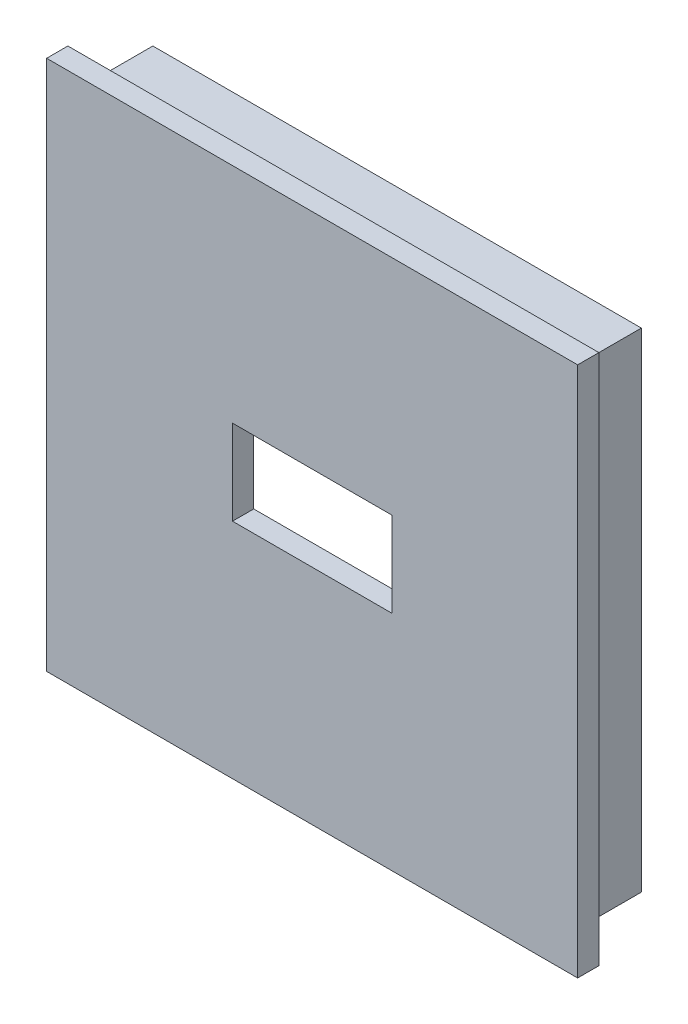
ISO-10303-21;
HEADER;
FILE_DESCRIPTION(('STEP AP214'),'2;1');
FILE_NAME('part.step','',(''),(''),'','','');
FILE_SCHEMA(('AUTOMOTIVE_DESIGN { 1 0 10303 214 1 1 1 1 }'));
ENDSEC;
DATA;
#1=APPLICATION_CONTEXT('core data for automotive mechanical design processes');
#2=APPLICATION_PROTOCOL_DEFINITION('international standard','automotive_design',2000,#1);
#3=PRODUCT_CONTEXT('',#1,'mechanical');
#4=PRODUCT('Part','Part','',(#3));
#5=PRODUCT_RELATED_PRODUCT_CATEGORY('part','',(#4));
#6=PRODUCT_DEFINITION_FORMATION('','',#4);
#7=PRODUCT_DEFINITION_CONTEXT('part definition',#1,'design');
#8=PRODUCT_DEFINITION('design','',#6,#7);
#9=PRODUCT_DEFINITION_SHAPE('','',#8);
#10=(LENGTH_UNIT() NAMED_UNIT(*) SI_UNIT(.MILLI.,.METRE.));
#11=(NAMED_UNIT(*) PLANE_ANGLE_UNIT() SI_UNIT($,.RADIAN.));
#12=(NAMED_UNIT(*) SI_UNIT($,.STERADIAN.) SOLID_ANGLE_UNIT());
#13=UNCERTAINTY_MEASURE_WITH_UNIT(LENGTH_MEASURE(1.E-05),#10,'distance_accuracy_value','');
#14=(GEOMETRIC_REPRESENTATION_CONTEXT(3) GLOBAL_UNCERTAINTY_ASSIGNED_CONTEXT((#13)) GLOBAL_UNIT_ASSIGNED_CONTEXT((#10,
#11,#12)) REPRESENTATION_CONTEXT('',''));
#15=CARTESIAN_POINT('',(0.,0.,0.));
#16=DIRECTION('',(0.,0.,1.));
#17=DIRECTION('',(1.,0.,0.));
#18=AXIS2_PLACEMENT_3D('',#15,#16,#17);
#19=CARTESIAN_POINT('',(0.,0.,-3.));
#20=DIRECTION('',(0.,0.,1.));
#21=DIRECTION('',(1.,0.,0.));
#22=AXIS2_PLACEMENT_3D('',#19,#20,#21);
#23=PLANE('',#22);
#24=DIRECTION('',(0.,1.,0.));
#25=VECTOR('',#24,1.);
#26=CARTESIAN_POINT('',(-11.5,-11.5,-3.));
#27=LINE('',#26,#25);
#28=CARTESIAN_POINT('',(-11.5,-11.5,-3.));
#29=VERTEX_POINT('',#28);
#30=CARTESIAN_POINT('',(-11.5,11.5,-3.));
#31=VERTEX_POINT('',#30);
#32=EDGE_CURVE('E231',#29,#31,#27,.T.);
#33=ORIENTED_EDGE('',*,*,#32,.T.);
#34=DIRECTION('',(1.,0.,0.));
#35=VECTOR('',#34,1.);
#36=CARTESIAN_POINT('',(11.5,11.5,-3.));
#37=LINE('',#36,#35);
#38=CARTESIAN_POINT('',(11.5,11.5,-3.));
#39=VERTEX_POINT('',#38);
#40=EDGE_CURVE('E235',#31,#39,#37,.T.);
#41=ORIENTED_EDGE('',*,*,#40,.T.);
#42=DIRECTION('',(0.,-1.,0.));
#43=VECTOR('',#42,1.);
#44=CARTESIAN_POINT('',(11.5,-11.5,-3.));
#45=LINE('',#44,#43);
#46=CARTESIAN_POINT('',(11.5,-11.5,-3.));
#47=VERTEX_POINT('',#46);
#48=EDGE_CURVE('E239',#39,#47,#45,.T.);
#49=ORIENTED_EDGE('',*,*,#48,.T.);
#50=DIRECTION('',(-1.,0.,0.));
#51=VECTOR('',#50,1.);
#52=CARTESIAN_POINT('',(11.5,-11.5,-3.));
#53=LINE('',#52,#51);
#54=EDGE_CURVE('E242',#47,#29,#53,.T.);
#55=ORIENTED_EDGE('',*,*,#54,.T.);
#56=EDGE_LOOP('',(#33,#41,#49,#55));
#57=FACE_BOUND('',#56,.T.);
#58=DIRECTION('',(0.,1.,0.));
#59=VECTOR('',#58,1.);
#60=CARTESIAN_POINT('',(-10.5,0.,-3.));
#61=LINE('',#60,#59);
#62=CARTESIAN_POINT('',(-10.5,-10.5,-3.));
#63=VERTEX_POINT('',#62);
#64=CARTESIAN_POINT('',(-10.5,10.5,-3.));
#65=VERTEX_POINT('',#64);
#66=EDGE_CURVE('E183',#63,#65,#61,.T.);
#67=ORIENTED_EDGE('',*,*,#66,.F.);
#68=DIRECTION('',(-1.,0.,0.));
#69=VECTOR('',#68,1.);
#70=CARTESIAN_POINT('',(0.,-10.5,-3.));
#71=LINE('',#70,#69);
#72=CARTESIAN_POINT('',(10.5,-10.5,-3.));
#73=VERTEX_POINT('',#72);
#74=EDGE_CURVE('E200',#73,#63,#71,.T.);
#75=ORIENTED_EDGE('',*,*,#74,.F.);
#76=DIRECTION('',(0.,-1.,0.));
#77=VECTOR('',#76,1.);
#78=CARTESIAN_POINT('',(10.5,0.,-3.));
#79=LINE('',#78,#77);
#80=CARTESIAN_POINT('',(10.5,10.5,-3.));
#81=VERTEX_POINT('',#80);
#82=EDGE_CURVE('E212',#81,#73,#79,.T.);
#83=ORIENTED_EDGE('',*,*,#82,.F.);
#84=DIRECTION('',(1.,0.,0.));
#85=VECTOR('',#84,1.);
#86=CARTESIAN_POINT('',(0.,10.5,-3.));
#87=LINE('',#86,#85);
#88=EDGE_CURVE('E209',#65,#81,#87,.T.);
#89=ORIENTED_EDGE('',*,*,#88,.F.);
#90=EDGE_LOOP('',(#67,#75,#83,#89));
#91=FACE_BOUND('',#90,.T.);
#92=ADVANCED_FACE('F38',(#57,#91),#23,.F.);
#93=CARTESIAN_POINT('',(12.5,-12.5,1.));
#94=DIRECTION('',(-1.,0.,0.));
#95=DIRECTION('',(0.,0.,1.));
#96=AXIS2_PLACEMENT_3D('',#93,#94,#95);
#97=PLANE('',#96);
#98=DIRECTION('',(0.,1.,0.));
#99=VECTOR('',#98,1.);
#100=CARTESIAN_POINT('',(12.5,-12.5,0.));
#101=LINE('',#100,#99);
#102=CARTESIAN_POINT('',(12.5,-12.5,0.));
#103=VERTEX_POINT('',#102);
#104=CARTESIAN_POINT('',(12.5,12.5,0.));
#105=VERTEX_POINT('',#104);
#106=EDGE_CURVE('E275',#103,#105,#101,.T.);
#107=ORIENTED_EDGE('',*,*,#106,.T.);
#108=DIRECTION('',(0.,0.,-1.));
#109=VECTOR('',#108,1.);
#110=CARTESIAN_POINT('',(12.5,12.5,1.));
#111=LINE('',#110,#109);
#112=CARTESIAN_POINT('',(12.5,12.5,1.));
#113=VERTEX_POINT('',#112);
#114=EDGE_CURVE('E313',#113,#105,#111,.T.);
#115=ORIENTED_EDGE('',*,*,#114,.F.);
#116=DIRECTION('',(0.,1.,0.));
#117=VECTOR('',#116,1.);
#118=CARTESIAN_POINT('',(12.5,-12.5,1.));
#119=LINE('',#118,#117);
#120=CARTESIAN_POINT('',(12.5,-12.5,1.));
#121=VERTEX_POINT('',#120);
#122=EDGE_CURVE('E276',#121,#113,#119,.T.);
#123=ORIENTED_EDGE('',*,*,#122,.F.);
#124=DIRECTION('',(0.,0.,-1.));
#125=VECTOR('',#124,1.);
#126=CARTESIAN_POINT('',(12.5,-12.5,1.));
#127=LINE('',#126,#125);
#128=EDGE_CURVE('E290',#121,#103,#127,.T.);
#129=ORIENTED_EDGE('',*,*,#128,.T.);
#130=EDGE_LOOP('',(#107,#115,#123,#129));
#131=FACE_BOUND('',#130,.T.);
#132=ADVANCED_FACE('F40',(#131),#97,.F.);
#133=CARTESIAN_POINT('',(-12.5,12.5,1.));
#134=DIRECTION('',(0.,-1.,0.));
#135=DIRECTION('',(0.,0.,-1.));
#136=AXIS2_PLACEMENT_3D('',#133,#134,#135);
#137=PLANE('',#136);
#138=DIRECTION('',(-1.,0.,0.));
#139=VECTOR('',#138,1.);
#140=CARTESIAN_POINT('',(-12.5,12.5,0.));
#141=LINE('',#140,#139);
#142=CARTESIAN_POINT('',(-12.5,12.5,0.));
#143=VERTEX_POINT('',#142);
#144=EDGE_CURVE('E294',#105,#143,#141,.T.);
#145=ORIENTED_EDGE('',*,*,#144,.T.);
#146=DIRECTION('',(0.,0.,-1.));
#147=VECTOR('',#146,1.);
#148=CARTESIAN_POINT('',(-12.5,12.5,1.));
#149=LINE('',#148,#147);
#150=CARTESIAN_POINT('',(-12.5,12.5,1.));
#151=VERTEX_POINT('',#150);
#152=EDGE_CURVE('E309',#151,#143,#149,.T.);
#153=ORIENTED_EDGE('',*,*,#152,.F.);
#154=DIRECTION('',(-1.,0.,0.));
#155=VECTOR('',#154,1.);
#156=CARTESIAN_POINT('',(-12.5,12.5,1.));
#157=LINE('',#156,#155);
#158=EDGE_CURVE('E280',#113,#151,#157,.T.);
#159=ORIENTED_EDGE('',*,*,#158,.F.);
#160=ORIENTED_EDGE('',*,*,#114,.T.);
#161=EDGE_LOOP('',(#145,#153,#159,#160));
#162=FACE_BOUND('',#161,.T.);
#163=ADVANCED_FACE('F344',(#162),#137,.F.);
#164=CARTESIAN_POINT('',(-12.5,-12.5,1.));
#165=DIRECTION('',(1.,0.,0.));
#166=DIRECTION('',(0.,0.,-1.));
#167=AXIS2_PLACEMENT_3D('',#164,#165,#166);
#168=PLANE('',#167);
#169=DIRECTION('',(0.,-1.,0.));
#170=VECTOR('',#169,1.);
#171=CARTESIAN_POINT('',(-12.5,-12.5,0.));
#172=LINE('',#171,#170);
#173=CARTESIAN_POINT('',(-12.5,-12.5,0.));
#174=VERTEX_POINT('',#173);
#175=EDGE_CURVE('E297',#143,#174,#172,.T.);
#176=ORIENTED_EDGE('',*,*,#175,.T.);
#177=DIRECTION('',(0.,0.,-1.));
#178=VECTOR('',#177,1.);
#179=CARTESIAN_POINT('',(-12.5,-12.5,1.));
#180=LINE('',#179,#178);
#181=CARTESIAN_POINT('',(-12.5,-12.5,1.));
#182=VERTEX_POINT('',#181);
#183=EDGE_CURVE('E305',#182,#174,#180,.T.);
#184=ORIENTED_EDGE('',*,*,#183,.F.);
#185=DIRECTION('',(0.,-1.,0.));
#186=VECTOR('',#185,1.);
#187=CARTESIAN_POINT('',(-12.5,-12.5,1.));
#188=LINE('',#187,#186);
#189=EDGE_CURVE('E284',#151,#182,#188,.T.);
#190=ORIENTED_EDGE('',*,*,#189,.F.);
#191=ORIENTED_EDGE('',*,*,#152,.T.);
#192=EDGE_LOOP('',(#176,#184,#190,#191));
#193=FACE_BOUND('',#192,.T.);
#194=ADVANCED_FACE('F376',(#193),#168,.F.);
#195=CARTESIAN_POINT('',(-12.5,-12.5,1.));
#196=DIRECTION('',(0.,1.,0.));
#197=DIRECTION('',(0.,0.,1.));
#198=AXIS2_PLACEMENT_3D('',#195,#196,#197);
#199=PLANE('',#198);
#200=DIRECTION('',(1.,0.,0.));
#201=VECTOR('',#200,1.);
#202=CARTESIAN_POINT('',(-12.5,-12.5,0.));
#203=LINE('',#202,#201);
#204=EDGE_CURVE('E281',#174,#103,#203,.T.);
#205=ORIENTED_EDGE('',*,*,#204,.T.);
#206=ORIENTED_EDGE('',*,*,#128,.F.);
#207=DIRECTION('',(1.,0.,0.));
#208=VECTOR('',#207,1.);
#209=CARTESIAN_POINT('',(-12.5,-12.5,1.));
#210=LINE('',#209,#208);
#211=EDGE_CURVE('E287',#182,#121,#210,.T.);
#212=ORIENTED_EDGE('',*,*,#211,.F.);
#213=ORIENTED_EDGE('',*,*,#183,.T.);
#214=EDGE_LOOP('',(#205,#206,#212,#213));
#215=FACE_BOUND('',#214,.T.);
#216=ADVANCED_FACE('F370',(#215),#199,.F.);
#217=CARTESIAN_POINT('',(0.,0.,1.));
#218=DIRECTION('',(0.,0.,-1.));
#219=DIRECTION('',(-1.,0.,0.));
#220=AXIS2_PLACEMENT_3D('',#217,#218,#219);
#221=PLANE('',#220);
#222=DIRECTION('',(-1.,0.,0.));
#223=VECTOR('',#222,1.);
#224=CARTESIAN_POINT('',(0.,-2.,1.));
#225=LINE('',#224,#223);
#226=CARTESIAN_POINT('',(3.75,-2.,0.999999999999999));
#227=VERTEX_POINT('',#226);
#228=CARTESIAN_POINT('',(-3.75,-2.,0.999999999999999));
#229=VERTEX_POINT('',#228);
#230=EDGE_CURVE('E47',#227,#229,#225,.T.);
#231=ORIENTED_EDGE('',*,*,#230,.T.);
#232=DIRECTION('',(0.,1.,0.));
#233=VECTOR('',#232,1.);
#234=CARTESIAN_POINT('',(-3.75,0.,1.));
#235=LINE('',#234,#233);
#236=CARTESIAN_POINT('',(-3.75,2.,0.999999999999999));
#237=VERTEX_POINT('',#236);
#238=EDGE_CURVE('E11',#229,#237,#235,.T.);
#239=ORIENTED_EDGE('',*,*,#238,.T.);
#240=DIRECTION('',(1.,0.,0.));
#241=VECTOR('',#240,1.);
#242=CARTESIAN_POINT('',(0.,2.,1.));
#243=LINE('',#242,#241);
#244=CARTESIAN_POINT('',(3.75,2.,1.));
#245=VERTEX_POINT('',#244);
#246=EDGE_CURVE('E157',#237,#245,#243,.T.);
#247=ORIENTED_EDGE('',*,*,#246,.T.);
#248=DIRECTION('',(0.,-1.,0.));
#249=VECTOR('',#248,1.);
#250=CARTESIAN_POINT('',(3.75,0.,1.));
#251=LINE('',#250,#249);
#252=EDGE_CURVE('E319',#245,#227,#251,.T.);
#253=ORIENTED_EDGE('',*,*,#252,.T.);
#254=EDGE_LOOP('',(#231,#239,#247,#253));
#255=FACE_BOUND('',#254,.T.);
#256=ORIENTED_EDGE('',*,*,#122,.T.);
#257=ORIENTED_EDGE('',*,*,#158,.T.);
#258=ORIENTED_EDGE('',*,*,#189,.T.);
#259=ORIENTED_EDGE('',*,*,#211,.T.);
#260=EDGE_LOOP('',(#256,#257,#258,#259));
#261=FACE_BOUND('',#260,.T.);
#262=ADVANCED_FACE('F325',(#255,#261),#221,.F.);
#263=CARTESIAN_POINT('',(0.,0.,0.));
#264=DIRECTION('',(0.,0.,-1.));
#265=DIRECTION('',(-1.,0.,0.));
#266=AXIS2_PLACEMENT_3D('',#263,#264,#265);
#267=PLANE('',#266);
#268=DIRECTION('',(0.,1.,0.));
#269=VECTOR('',#268,1.);
#270=CARTESIAN_POINT('',(-11.5,-11.5,0.));
#271=LINE('',#270,#269);
#272=CARTESIAN_POINT('',(-11.5,-11.5,0.));
#273=VERTEX_POINT('',#272);
#274=CARTESIAN_POINT('',(-11.5,11.5,0.));
#275=VERTEX_POINT('',#274);
#276=EDGE_CURVE('E230',#273,#275,#271,.T.);
#277=ORIENTED_EDGE('',*,*,#276,.F.);
#278=DIRECTION('',(-1.,0.,0.));
#279=VECTOR('',#278,1.);
#280=CARTESIAN_POINT('',(11.5,-11.5,0.));
#281=LINE('',#280,#279);
#282=CARTESIAN_POINT('',(11.5,-11.5,0.));
#283=VERTEX_POINT('',#282);
#284=EDGE_CURVE('E236',#283,#273,#281,.T.);
#285=ORIENTED_EDGE('',*,*,#284,.F.);
#286=DIRECTION('',(0.,-1.,0.));
#287=VECTOR('',#286,1.);
#288=CARTESIAN_POINT('',(11.5,-11.5,0.));
#289=LINE('',#288,#287);
#290=CARTESIAN_POINT('',(11.5,11.5,0.));
#291=VERTEX_POINT('',#290);
#292=EDGE_CURVE('E253',#291,#283,#289,.T.);
#293=ORIENTED_EDGE('',*,*,#292,.F.);
#294=DIRECTION('',(1.,0.,0.));
#295=VECTOR('',#294,1.);
#296=CARTESIAN_POINT('',(11.5,11.5,0.));
#297=LINE('',#296,#295);
#298=EDGE_CURVE('E249',#275,#291,#297,.T.);
#299=ORIENTED_EDGE('',*,*,#298,.F.);
#300=EDGE_LOOP('',(#277,#285,#293,#299));
#301=FACE_BOUND('',#300,.T.);
#302=ORIENTED_EDGE('',*,*,#106,.F.);
#303=ORIENTED_EDGE('',*,*,#204,.F.);
#304=ORIENTED_EDGE('',*,*,#175,.F.);
#305=ORIENTED_EDGE('',*,*,#144,.F.);
#306=EDGE_LOOP('',(#302,#303,#304,#305));
#307=FACE_BOUND('',#306,.T.);
#308=ADVANCED_FACE('F366',(#301,#307),#267,.T.);
#309=CARTESIAN_POINT('',(-11.5,-11.5,-3.));
#310=DIRECTION('',(1.,0.,0.));
#311=DIRECTION('',(0.,0.,-1.));
#312=AXIS2_PLACEMENT_3D('',#309,#310,#311);
#313=PLANE('',#312);
#314=ORIENTED_EDGE('',*,*,#276,.T.);
#315=DIRECTION('',(0.,0.,1.));
#316=VECTOR('',#315,1.);
#317=CARTESIAN_POINT('',(-11.5,11.5,-3.));
#318=LINE('',#317,#316);
#319=EDGE_CURVE('E271',#31,#275,#318,.T.);
#320=ORIENTED_EDGE('',*,*,#319,.F.);
#321=ORIENTED_EDGE('',*,*,#32,.F.);
#322=DIRECTION('',(0.,0.,1.));
#323=VECTOR('',#322,1.);
#324=CARTESIAN_POINT('',(-11.5,-11.5,-3.));
#325=LINE('',#324,#323);
#326=EDGE_CURVE('E245',#29,#273,#325,.T.);
#327=ORIENTED_EDGE('',*,*,#326,.T.);
#328=EDGE_LOOP('',(#314,#320,#321,#327));
#329=FACE_BOUND('',#328,.T.);
#330=ADVANCED_FACE('F362',(#329),#313,.F.);
#331=CARTESIAN_POINT('',(11.5,11.5,-3.));
#332=DIRECTION('',(0.,-1.,0.));
#333=DIRECTION('',(0.,0.,-1.));
#334=AXIS2_PLACEMENT_3D('',#331,#332,#333);
#335=PLANE('',#334);
#336=ORIENTED_EDGE('',*,*,#298,.T.);
#337=DIRECTION('',(0.,0.,1.));
#338=VECTOR('',#337,1.);
#339=CARTESIAN_POINT('',(11.5,11.5,-3.));
#340=LINE('',#339,#338);
#341=EDGE_CURVE('E267',#39,#291,#340,.T.);
#342=ORIENTED_EDGE('',*,*,#341,.F.);
#343=ORIENTED_EDGE('',*,*,#40,.F.);
#344=ORIENTED_EDGE('',*,*,#319,.T.);
#345=EDGE_LOOP('',(#336,#342,#343,#344));
#346=FACE_BOUND('',#345,.T.);
#347=ADVANCED_FACE('F358',(#346),#335,.F.);
#348=CARTESIAN_POINT('',(11.5,-11.5,-3.));
#349=DIRECTION('',(-1.,0.,0.));
#350=DIRECTION('',(0.,0.,1.));
#351=AXIS2_PLACEMENT_3D('',#348,#349,#350);
#352=PLANE('',#351);
#353=ORIENTED_EDGE('',*,*,#292,.T.);
#354=DIRECTION('',(0.,0.,1.));
#355=VECTOR('',#354,1.);
#356=CARTESIAN_POINT('',(11.5,-11.5,-3.));
#357=LINE('',#356,#355);
#358=EDGE_CURVE('E263',#47,#283,#357,.T.);
#359=ORIENTED_EDGE('',*,*,#358,.F.);
#360=ORIENTED_EDGE('',*,*,#48,.F.);
#361=ORIENTED_EDGE('',*,*,#341,.T.);
#362=EDGE_LOOP('',(#353,#359,#360,#361));
#363=FACE_BOUND('',#362,.T.);
#364=ADVANCED_FACE('F354',(#363),#352,.F.);
#365=CARTESIAN_POINT('',(11.5,-11.5,-3.));
#366=DIRECTION('',(0.,1.,0.));
#367=DIRECTION('',(0.,0.,1.));
#368=AXIS2_PLACEMENT_3D('',#365,#366,#367);
#369=PLANE('',#368);
#370=ORIENTED_EDGE('',*,*,#284,.T.);
#371=ORIENTED_EDGE('',*,*,#326,.F.);
#372=ORIENTED_EDGE('',*,*,#54,.F.);
#373=ORIENTED_EDGE('',*,*,#358,.T.);
#374=EDGE_LOOP('',(#370,#371,#372,#373));
#375=FACE_BOUND('',#374,.T.);
#376=ADVANCED_FACE('F351',(#375),#369,.F.);
#377=CARTESIAN_POINT('',(0.,0.,0.));
#378=DIRECTION('',(0.,0.,-1.));
#379=DIRECTION('',(-1.,0.,0.));
#380=AXIS2_PLACEMENT_3D('',#377,#378,#379);
#381=PLANE('',#380);
#382=DIRECTION('',(0.,1.,0.));
#383=VECTOR('',#382,1.);
#384=CARTESIAN_POINT('',(-3.75,-2.,0.));
#385=LINE('',#384,#383);
#386=CARTESIAN_POINT('',(-3.75,-2.,0.));
#387=VERTEX_POINT('',#386);
#388=CARTESIAN_POINT('',(-3.75,2.,0.));
#389=VERTEX_POINT('',#388);
#390=EDGE_CURVE('E163',#387,#389,#385,.T.);
#391=ORIENTED_EDGE('',*,*,#390,.F.);
#392=DIRECTION('',(-1.,0.,0.));
#393=VECTOR('',#392,1.);
#394=CARTESIAN_POINT('',(3.75,-2.,0.));
#395=LINE('',#394,#393);
#396=CARTESIAN_POINT('',(3.75,-2.,0.));
#397=VERTEX_POINT('',#396);
#398=EDGE_CURVE('E160',#397,#387,#395,.T.);
#399=ORIENTED_EDGE('',*,*,#398,.F.);
#400=DIRECTION('',(0.,-1.,0.));
#401=VECTOR('',#400,1.);
#402=CARTESIAN_POINT('',(3.75,-2.,0.));
#403=LINE('',#402,#401);
#404=CARTESIAN_POINT('',(3.75,2.,0.));
#405=VERTEX_POINT('',#404);
#406=EDGE_CURVE('E54',#405,#397,#403,.T.);
#407=ORIENTED_EDGE('',*,*,#406,.F.);
#408=DIRECTION('',(1.,0.,0.));
#409=VECTOR('',#408,1.);
#410=CARTESIAN_POINT('',(3.75,2.,0.));
#411=LINE('',#410,#409);
#412=EDGE_CURVE('E155',#389,#405,#411,.T.);
#413=ORIENTED_EDGE('',*,*,#412,.F.);
#414=EDGE_LOOP('',(#391,#399,#407,#413));
#415=FACE_BOUND('',#414,.T.);
#416=DIRECTION('',(0.,1.,0.));
#417=VECTOR('',#416,1.);
#418=CARTESIAN_POINT('',(10.5,0.,0.));
#419=LINE('',#418,#417);
#420=CARTESIAN_POINT('',(10.5,-10.5,0.));
#421=VERTEX_POINT('',#420);
#422=CARTESIAN_POINT('',(10.5,10.5,0.));
#423=VERTEX_POINT('',#422);
#424=EDGE_CURVE('E223',#421,#423,#419,.T.);
#425=ORIENTED_EDGE('',*,*,#424,.F.);
#426=DIRECTION('',(1.,0.,0.));
#427=VECTOR('',#426,1.);
#428=CARTESIAN_POINT('',(0.,-10.5,0.));
#429=LINE('',#428,#427);
#430=CARTESIAN_POINT('',(-10.5,-10.5,0.));
#431=VERTEX_POINT('',#430);
#432=EDGE_CURVE('E220',#431,#421,#429,.T.);
#433=ORIENTED_EDGE('',*,*,#432,.F.);
#434=DIRECTION('',(0.,-1.,0.));
#435=VECTOR('',#434,1.);
#436=CARTESIAN_POINT('',(-10.5,0.,0.));
#437=LINE('',#436,#435);
#438=CARTESIAN_POINT('',(-10.5,10.5,0.));
#439=VERTEX_POINT('',#438);
#440=EDGE_CURVE('E193',#439,#431,#437,.T.);
#441=ORIENTED_EDGE('',*,*,#440,.F.);
#442=DIRECTION('',(-1.,0.,0.));
#443=VECTOR('',#442,1.);
#444=CARTESIAN_POINT('',(0.,10.5,0.));
#445=LINE('',#444,#443);
#446=EDGE_CURVE('E226',#423,#439,#445,.T.);
#447=ORIENTED_EDGE('',*,*,#446,.F.);
#448=EDGE_LOOP('',(#425,#433,#441,#447));
#449=FACE_BOUND('',#448,.T.);
#450=ADVANCED_FACE('F172',(#415,#449),#381,.T.);
#451=CARTESIAN_POINT('',(-10.5,-11.5,-3.));
#452=DIRECTION('',(1.,0.,0.));
#453=DIRECTION('',(0.,0.,-1.));
#454=AXIS2_PLACEMENT_3D('',#451,#452,#453);
#455=PLANE('',#454);
#456=ORIENTED_EDGE('',*,*,#440,.T.);
#457=DIRECTION('',(0.,0.,1.));
#458=VECTOR('',#457,1.);
#459=CARTESIAN_POINT('',(-10.5,-10.5,-3.));
#460=LINE('',#459,#458);
#461=EDGE_CURVE('E195',#63,#431,#460,.T.);
#462=ORIENTED_EDGE('',*,*,#461,.F.);
#463=ORIENTED_EDGE('',*,*,#66,.T.);
#464=DIRECTION('',(0.,0.,1.));
#465=VECTOR('',#464,1.);
#466=CARTESIAN_POINT('',(-10.5,10.5,-3.));
#467=LINE('',#466,#465);
#468=EDGE_CURVE('E189',#65,#439,#467,.T.);
#469=ORIENTED_EDGE('',*,*,#468,.T.);
#470=EDGE_LOOP('',(#456,#462,#463,#469));
#471=FACE_BOUND('',#470,.T.);
#472=ADVANCED_FACE('F439',(#471),#455,.T.);
#473=CARTESIAN_POINT('',(11.5,10.5,-3.));
#474=DIRECTION('',(0.,-1.,0.));
#475=DIRECTION('',(0.,0.,-1.));
#476=AXIS2_PLACEMENT_3D('',#473,#474,#475);
#477=PLANE('',#476);
#478=ORIENTED_EDGE('',*,*,#446,.T.);
#479=ORIENTED_EDGE('',*,*,#468,.F.);
#480=ORIENTED_EDGE('',*,*,#88,.T.);
#481=DIRECTION('',(0.,0.,1.));
#482=VECTOR('',#481,1.);
#483=CARTESIAN_POINT('',(10.5,10.5,-3.));
#484=LINE('',#483,#482);
#485=EDGE_CURVE('E194',#81,#423,#484,.T.);
#486=ORIENTED_EDGE('',*,*,#485,.T.);
#487=EDGE_LOOP('',(#478,#479,#480,#486));
#488=FACE_BOUND('',#487,.T.);
#489=ADVANCED_FACE('F450',(#488),#477,.T.);
#490=CARTESIAN_POINT('',(10.5,-11.5,-3.));
#491=DIRECTION('',(-1.,0.,0.));
#492=DIRECTION('',(0.,0.,1.));
#493=AXIS2_PLACEMENT_3D('',#490,#491,#492);
#494=PLANE('',#493);
#495=ORIENTED_EDGE('',*,*,#424,.T.);
#496=ORIENTED_EDGE('',*,*,#485,.F.);
#497=ORIENTED_EDGE('',*,*,#82,.T.);
#498=DIRECTION('',(0.,0.,1.));
#499=VECTOR('',#498,1.);
#500=CARTESIAN_POINT('',(10.5,-10.5,-3.));
#501=LINE('',#500,#499);
#502=EDGE_CURVE('E199',#73,#421,#501,.T.);
#503=ORIENTED_EDGE('',*,*,#502,.T.);
#504=EDGE_LOOP('',(#495,#496,#497,#503));
#505=FACE_BOUND('',#504,.T.);
#506=ADVANCED_FACE('F457',(#505),#494,.T.);
#507=CARTESIAN_POINT('',(11.5,-10.5,-3.));
#508=DIRECTION('',(0.,1.,0.));
#509=DIRECTION('',(0.,0.,1.));
#510=AXIS2_PLACEMENT_3D('',#507,#508,#509);
#511=PLANE('',#510);
#512=ORIENTED_EDGE('',*,*,#432,.T.);
#513=ORIENTED_EDGE('',*,*,#502,.F.);
#514=ORIENTED_EDGE('',*,*,#74,.T.);
#515=ORIENTED_EDGE('',*,*,#461,.T.);
#516=EDGE_LOOP('',(#512,#513,#514,#515));
#517=FACE_BOUND('',#516,.T.);
#518=ADVANCED_FACE('F349',(#517),#511,.T.);
#519=CARTESIAN_POINT('',(-3.75,-2.,10.));
#520=DIRECTION('',(-1.,0.,0.));
#521=DIRECTION('',(0.,0.,1.));
#522=AXIS2_PLACEMENT_3D('',#519,#520,#521);
#523=PLANE('',#522);
#524=DIRECTION('',(0.,0.,-1.));
#525=VECTOR('',#524,1.);
#526=CARTESIAN_POINT('',(-3.75,-2.,10.));
#527=LINE('',#526,#525);
#528=EDGE_CURVE('E166',#229,#387,#527,.T.);
#529=ORIENTED_EDGE('',*,*,#528,.T.);
#530=ORIENTED_EDGE('',*,*,#390,.T.);
#531=DIRECTION('',(0.,0.,-1.));
#532=VECTOR('',#531,1.);
#533=CARTESIAN_POINT('',(-3.75,2.,10.));
#534=LINE('',#533,#532);
#535=EDGE_CURVE('E151',#237,#389,#534,.T.);
#536=ORIENTED_EDGE('',*,*,#535,.F.);
#537=ORIENTED_EDGE('',*,*,#238,.F.);
#538=EDGE_LOOP('',(#529,#530,#536,#537));
#539=FACE_BOUND('',#538,.T.);
#540=ADVANCED_FACE('F164',(#539),#523,.F.);
#541=CARTESIAN_POINT('',(3.75,-2.,10.));
#542=DIRECTION('',(0.,-1.,0.));
#543=DIRECTION('',(0.,0.,-1.));
#544=AXIS2_PLACEMENT_3D('',#541,#542,#543);
#545=PLANE('',#544);
#546=DIRECTION('',(0.,0.,-1.));
#547=VECTOR('',#546,1.);
#548=CARTESIAN_POINT('',(3.75,-2.,10.));
#549=LINE('',#548,#547);
#550=EDGE_CURVE('E184',#227,#397,#549,.T.);
#551=ORIENTED_EDGE('',*,*,#550,.T.);
#552=ORIENTED_EDGE('',*,*,#398,.T.);
#553=ORIENTED_EDGE('',*,*,#528,.F.);
#554=ORIENTED_EDGE('',*,*,#230,.F.);
#555=EDGE_LOOP('',(#551,#552,#553,#554));
#556=FACE_BOUND('',#555,.T.);
#557=ADVANCED_FACE('F328',(#556),#545,.F.);
#558=CARTESIAN_POINT('',(3.75,-2.,10.));
#559=DIRECTION('',(1.,0.,0.));
#560=DIRECTION('',(0.,0.,-1.));
#561=AXIS2_PLACEMENT_3D('',#558,#559,#560);
#562=PLANE('',#561);
#563=DIRECTION('',(0.,0.,-1.));
#564=VECTOR('',#563,1.);
#565=CARTESIAN_POINT('',(3.75,2.,10.));
#566=LINE('',#565,#564);
#567=EDGE_CURVE('E61',#245,#405,#566,.T.);
#568=ORIENTED_EDGE('',*,*,#567,.T.);
#569=ORIENTED_EDGE('',*,*,#406,.T.);
#570=ORIENTED_EDGE('',*,*,#550,.F.);
#571=ORIENTED_EDGE('',*,*,#252,.F.);
#572=EDGE_LOOP('',(#568,#569,#570,#571));
#573=FACE_BOUND('',#572,.T.);
#574=ADVANCED_FACE('F329',(#573),#562,.F.);
#575=CARTESIAN_POINT('',(3.75,2.,10.));
#576=DIRECTION('',(0.,1.,0.));
#577=DIRECTION('',(0.,0.,1.));
#578=AXIS2_PLACEMENT_3D('',#575,#576,#577);
#579=PLANE('',#578);
#580=ORIENTED_EDGE('',*,*,#535,.T.);
#581=ORIENTED_EDGE('',*,*,#412,.T.);
#582=ORIENTED_EDGE('',*,*,#567,.F.);
#583=ORIENTED_EDGE('',*,*,#246,.F.);
#584=EDGE_LOOP('',(#580,#581,#582,#583));
#585=FACE_BOUND('',#584,.T.);
#586=ADVANCED_FACE('F153',(#585),#579,.F.);
#587=CLOSED_SHELL('',(#92,#132,#163,#194,#216,#262,#308,#330,#347,#364,#376,#450,#472,#489,#506,
#518,#540,#557,#574,#586));
#588=MANIFOLD_SOLID_BREP('B2',#587);
#589=ADVANCED_BREP_SHAPE_REPRESENTATION('',(#18,#588),#14);
#590=SHAPE_DEFINITION_REPRESENTATION(#9,#589);
ENDSEC;
END-ISO-10303-21;
